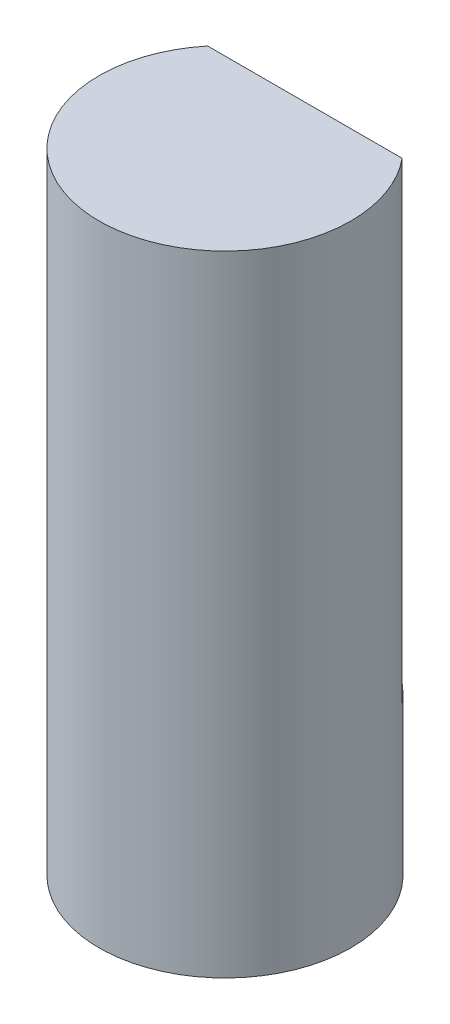
ISO-10303-21;
HEADER;
FILE_DESCRIPTION(('STEP AP214'),'2;1');
FILE_NAME('part.step','',(''),(''),'','','');
FILE_SCHEMA(('AUTOMOTIVE_DESIGN { 1 0 10303 214 1 1 1 1 }'));
ENDSEC;
DATA;
#1=APPLICATION_CONTEXT('core data for automotive mechanical design processes');
#2=APPLICATION_PROTOCOL_DEFINITION('international standard','automotive_design',2000,#1);
#3=PRODUCT_CONTEXT('',#1,'mechanical');
#4=PRODUCT('Part','Part','',(#3));
#5=PRODUCT_RELATED_PRODUCT_CATEGORY('part','',(#4));
#6=PRODUCT_DEFINITION_FORMATION('','',#4);
#7=PRODUCT_DEFINITION_CONTEXT('part definition',#1,'design');
#8=PRODUCT_DEFINITION('design','',#6,#7);
#9=PRODUCT_DEFINITION_SHAPE('','',#8);
#10=(LENGTH_UNIT() NAMED_UNIT(*) SI_UNIT(.MILLI.,.METRE.));
#11=(NAMED_UNIT(*) PLANE_ANGLE_UNIT() SI_UNIT($,.RADIAN.));
#12=(NAMED_UNIT(*) SI_UNIT($,.STERADIAN.) SOLID_ANGLE_UNIT());
#13=UNCERTAINTY_MEASURE_WITH_UNIT(LENGTH_MEASURE(1.E-05),#10,'distance_accuracy_value','');
#14=(GEOMETRIC_REPRESENTATION_CONTEXT(3) GLOBAL_UNCERTAINTY_ASSIGNED_CONTEXT((#13)) GLOBAL_UNIT_ASSIGNED_CONTEXT((#10,
#11,#12)) REPRESENTATION_CONTEXT('',''));
#15=CARTESIAN_POINT('',(0.,0.,0.));
#16=DIRECTION('',(0.,0.,1.));
#17=DIRECTION('',(1.,0.,0.));
#18=AXIS2_PLACEMENT_3D('',#15,#16,#17);
#19=CARTESIAN_POINT('',(0.,53.228,0.));
#20=DIRECTION('',(0.,1.,0.));
#21=DIRECTION('',(1.,0.,0.));
#22=AXIS2_PLACEMENT_3D('',#19,#20,#21);
#23=PLANE('',#22);
#24=CARTESIAN_POINT('',(0.,53.228,0.));
#25=DIRECTION('',(0.,1.,0.));
#26=DIRECTION('',(-1.,0.,0.));
#27=AXIS2_PLACEMENT_3D('',#24,#25,#26);
#28=CIRCLE('',#27,4.);
#29=CARTESIAN_POINT('',(4.,53.228,0.));
#30=VERTEX_POINT('',#29);
#31=EDGE_CURVE('E10',#30,#30,#28,.T.);
#32=ORIENTED_EDGE('',*,*,#31,.F.);
#33=EDGE_LOOP('',(#32));
#34=FACE_BOUND('',#33,.T.);
#35=ADVANCED_FACE('F16',(#34),#23,.F.);
#36=CARTESIAN_POINT('',(0.,53.228,0.));
#37=DIRECTION('',(0.,1.,0.));
#38=DIRECTION('',(-1.,0.,0.));
#39=AXIS2_PLACEMENT_3D('',#36,#37,#38);
#40=CYLINDRICAL_SURFACE('',#39,4.);
#41=DIRECTION('',(0.,1.,0.));
#42=VECTOR('',#41,1.);
#43=CARTESIAN_POINT('',(3.09004854330803,53.228,-2.54));
#44=LINE('',#43,#42);
#45=CARTESIAN_POINT('',(3.09004854330803,58.228,-2.54));
#46=VERTEX_POINT('',#45);
#47=CARTESIAN_POINT('',(3.09004854330803,73.228,-2.54));
#48=VERTEX_POINT('',#47);
#49=EDGE_CURVE('E19',#46,#48,#44,.T.);
#50=ORIENTED_EDGE('',*,*,#49,.T.);
#51=CARTESIAN_POINT('',(0.,73.228,0.));
#52=DIRECTION('',(0.,1.,0.));
#53=DIRECTION('',(-1.,0.,0.));
#54=AXIS2_PLACEMENT_3D('',#51,#52,#53);
#55=CIRCLE('',#54,4.);
#56=CARTESIAN_POINT('',(4.,73.228,0.));
#57=VERTEX_POINT('',#56);
#58=EDGE_CURVE('E57',#57,#48,#55,.T.);
#59=ORIENTED_EDGE('',*,*,#58,.F.);
#60=DIRECTION('',(0.,-1.,0.));
#61=VECTOR('',#60,1.);
#62=CARTESIAN_POINT('',(4.,53.228,0.));
#63=LINE('',#62,#61);
#64=EDGE_CURVE('E26',#57,#30,#63,.T.);
#65=ORIENTED_EDGE('',*,*,#64,.T.);
#66=ORIENTED_EDGE('',*,*,#31,.T.);
#67=ORIENTED_EDGE('',*,*,#64,.F.);
#68=CARTESIAN_POINT('',(0.,73.228,0.));
#69=DIRECTION('',(0.,1.,0.));
#70=DIRECTION('',(-1.,0.,0.));
#71=AXIS2_PLACEMENT_3D('',#68,#69,#70);
#72=CIRCLE('',#71,4.);
#73=CARTESIAN_POINT('',(-3.09004854330803,73.228,-2.54));
#74=VERTEX_POINT('',#73);
#75=EDGE_CURVE('E63',#74,#57,#72,.T.);
#76=ORIENTED_EDGE('',*,*,#75,.F.);
#77=DIRECTION('',(0.,-1.,0.));
#78=VECTOR('',#77,1.);
#79=CARTESIAN_POINT('',(-3.09004854330803,53.228,-2.54));
#80=LINE('',#79,#78);
#81=CARTESIAN_POINT('',(-3.09004854330803,58.228,-2.54));
#82=VERTEX_POINT('',#81);
#83=EDGE_CURVE('E66',#74,#82,#80,.T.);
#84=ORIENTED_EDGE('',*,*,#83,.T.);
#85=CARTESIAN_POINT('',(0.,58.228,0.));
#86=DIRECTION('',(0.,-1.,0.));
#87=DIRECTION('',(-1.,0.,0.));
#88=AXIS2_PLACEMENT_3D('',#85,#86,#87);
#89=CIRCLE('',#88,4.);
#90=EDGE_CURVE('E69',#82,#46,#89,.T.);
#91=ORIENTED_EDGE('',*,*,#90,.T.);
#92=EDGE_LOOP('',(#50,#59,#65,#66,#67,#76,#84,#91));
#93=FACE_BOUND('',#92,.T.);
#94=ADVANCED_FACE('F65',(#93),#40,.T.);
#95=CARTESIAN_POINT('',(0.,73.228,0.));
#96=DIRECTION('',(0.,1.,0.));
#97=DIRECTION('',(1.,0.,0.));
#98=AXIS2_PLACEMENT_3D('',#95,#96,#97);
#99=PLANE('',#98);
#100=DIRECTION('',(-1.,0.,0.));
#101=VECTOR('',#100,1.);
#102=CARTESIAN_POINT('',(1.54502427165401,73.228,-2.54));
#103=LINE('',#102,#101);
#104=EDGE_CURVE('E75',#48,#74,#103,.T.);
#105=ORIENTED_EDGE('',*,*,#104,.T.);
#106=ORIENTED_EDGE('',*,*,#75,.T.);
#107=ORIENTED_EDGE('',*,*,#58,.T.);
#108=EDGE_LOOP('',(#105,#106,#107));
#109=FACE_BOUND('',#108,.T.);
#110=ADVANCED_FACE('F80',(#109),#99,.T.);
#111=CARTESIAN_POINT('',(0.,58.228,-3.27));
#112=DIRECTION('',(0.,1.,0.));
#113=DIRECTION('',(1.,0.,0.));
#114=AXIS2_PLACEMENT_3D('',#111,#112,#113);
#115=PLANE('',#114);
#116=DIRECTION('',(-1.,0.,0.));
#117=VECTOR('',#116,1.);
#118=CARTESIAN_POINT('',(-3.09004854330803,58.228,-2.54));
#119=LINE('',#118,#117);
#120=EDGE_CURVE('E77',#46,#82,#119,.T.);
#121=ORIENTED_EDGE('',*,*,#120,.F.);
#122=ORIENTED_EDGE('',*,*,#90,.F.);
#123=EDGE_LOOP('',(#121,#122));
#124=FACE_BOUND('',#123,.T.);
#125=ADVANCED_FACE('F95',(#124),#115,.T.);
#126=CARTESIAN_POINT('',(3.09004854330803,73.228,-2.54));
#127=DIRECTION('',(0.,0.,1.));
#128=DIRECTION('',(1.,0.,0.));
#129=AXIS2_PLACEMENT_3D('',#126,#127,#128);
#130=PLANE('',#129);
#131=ORIENTED_EDGE('',*,*,#104,.F.);
#132=ORIENTED_EDGE('',*,*,#49,.F.);
#133=ORIENTED_EDGE('',*,*,#120,.T.);
#134=ORIENTED_EDGE('',*,*,#83,.F.);
#135=EDGE_LOOP('',(#131,#132,#133,#134));
#136=FACE_BOUND('',#135,.T.);
#137=ADVANCED_FACE('F73',(#136),#130,.F.);
#138=CLOSED_SHELL('',(#35,#94,#110,#125,#137));
#139=MANIFOLD_SOLID_BREP('B1',#138);
#140=ADVANCED_BREP_SHAPE_REPRESENTATION('',(#18,#139),#14);
#141=SHAPE_DEFINITION_REPRESENTATION(#9,#140);
ENDSEC;
END-ISO-10303-21;
